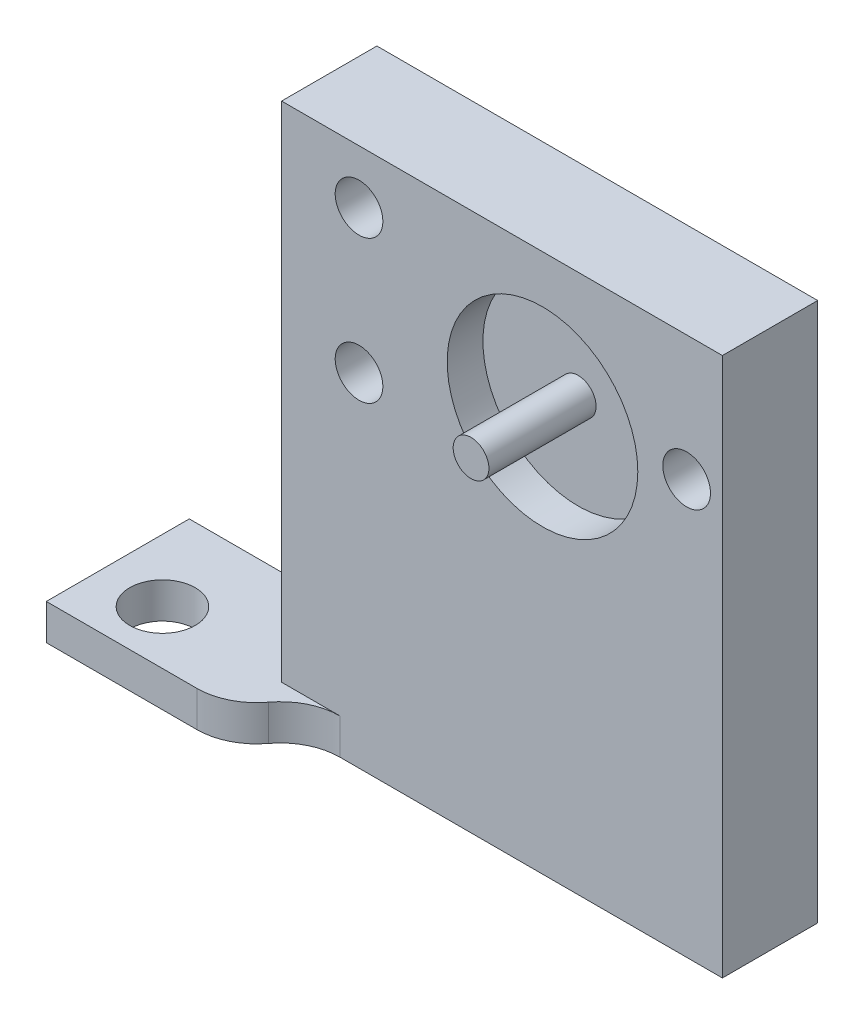
ISO-10303-21;
HEADER;
FILE_DESCRIPTION(('STEP AP214'),'2;1');
FILE_NAME('part.step','',(''),(''),'','','');
FILE_SCHEMA(('AUTOMOTIVE_DESIGN { 1 0 10303 214 1 1 1 1 }'));
ENDSEC;
DATA;
#1=APPLICATION_CONTEXT('core data for automotive mechanical design processes');
#2=APPLICATION_PROTOCOL_DEFINITION('international standard','automotive_design',2000,#1);
#3=PRODUCT_CONTEXT('',#1,'mechanical');
#4=PRODUCT('Part','Part','',(#3));
#5=PRODUCT_RELATED_PRODUCT_CATEGORY('part','',(#4));
#6=PRODUCT_DEFINITION_FORMATION('','',#4);
#7=PRODUCT_DEFINITION_CONTEXT('part definition',#1,'design');
#8=PRODUCT_DEFINITION('design','',#6,#7);
#9=PRODUCT_DEFINITION_SHAPE('','',#8);
#10=(LENGTH_UNIT() NAMED_UNIT(*) SI_UNIT(.MILLI.,.METRE.));
#11=(NAMED_UNIT(*) PLANE_ANGLE_UNIT() SI_UNIT($,.RADIAN.));
#12=(NAMED_UNIT(*) SI_UNIT($,.STERADIAN.) SOLID_ANGLE_UNIT());
#13=UNCERTAINTY_MEASURE_WITH_UNIT(LENGTH_MEASURE(1.E-05),#10,'distance_accuracy_value','');
#14=(GEOMETRIC_REPRESENTATION_CONTEXT(3) GLOBAL_UNCERTAINTY_ASSIGNED_CONTEXT((#13)) GLOBAL_UNIT_ASSIGNED_CONTEXT((#10,
#11,#12)) REPRESENTATION_CONTEXT('',''));
#15=CARTESIAN_POINT('',(0.,0.,0.));
#16=DIRECTION('',(0.,0.,1.));
#17=DIRECTION('',(1.,0.,0.));
#18=AXIS2_PLACEMENT_3D('',#15,#16,#17);
#19=CARTESIAN_POINT('',(0.,0.,8.));
#20=DIRECTION('',(0.,0.,1.));
#21=DIRECTION('',(1.,0.,0.));
#22=AXIS2_PLACEMENT_3D('',#19,#20,#21);
#23=PLANE('',#22);
#24=CARTESIAN_POINT('',(-12.,16.625,8.));
#25=DIRECTION('',(0.,0.,1.));
#26=DIRECTION('',(1.,0.,0.));
#27=AXIS2_PLACEMENT_3D('',#24,#25,#26);
#28=CIRCLE('',#27,2.);
#29=CARTESIAN_POINT('',(-10.,16.625,8.));
#30=VERTEX_POINT('',#29);
#31=EDGE_CURVE('E227',#30,#30,#28,.T.);
#32=ORIENTED_EDGE('',*,*,#31,.F.);
#33=EDGE_LOOP('',(#32));
#34=FACE_BOUND('',#33,.T.);
#35=CARTESIAN_POINT('',(-12.,4.625,8.));
#36=DIRECTION('',(0.,0.,1.));
#37=DIRECTION('',(1.,0.,0.));
#38=AXIS2_PLACEMENT_3D('',#35,#36,#37);
#39=CIRCLE('',#38,2.);
#40=CARTESIAN_POINT('',(-10.,4.625,8.));
#41=VERTEX_POINT('',#40);
#42=EDGE_CURVE('E221',#41,#41,#39,.T.);
#43=ORIENTED_EDGE('',*,*,#42,.F.);
#44=EDGE_LOOP('',(#43));
#45=FACE_BOUND('',#44,.T.);
#46=CARTESIAN_POINT('',(15.5,10.625,8.));
#47=DIRECTION('',(0.,0.,1.));
#48=DIRECTION('',(1.,0.,0.));
#49=AXIS2_PLACEMENT_3D('',#46,#47,#48);
#50=CIRCLE('',#49,2.);
#51=CARTESIAN_POINT('',(17.5,10.625,8.));
#52=VERTEX_POINT('',#51);
#53=EDGE_CURVE('E214',#52,#52,#50,.T.);
#54=ORIENTED_EDGE('',*,*,#53,.F.);
#55=EDGE_LOOP('',(#54));
#56=FACE_BOUND('',#55,.T.);
#57=CARTESIAN_POINT('',(3.4,9.125,8.));
#58=DIRECTION('',(0.,0.,1.));
#59=DIRECTION('',(1.,0.,0.));
#60=AXIS2_PLACEMENT_3D('',#57,#58,#59);
#61=CIRCLE('',#60,8.);
#62=CARTESIAN_POINT('',(11.4,9.125,8.));
#63=VERTEX_POINT('',#62);
#64=EDGE_CURVE('E204',#63,#63,#61,.T.);
#65=ORIENTED_EDGE('',*,*,#64,.F.);
#66=EDGE_LOOP('',(#65));
#67=FACE_BOUND('',#66,.T.);
#68=DIRECTION('',(1.,0.,0.));
#69=VECTOR('',#68,1.);
#70=CARTESIAN_POINT('',(0.,-21.125,8.));
#71=LINE('',#70,#69);
#72=CARTESIAN_POINT('',(-18.5,-21.125,8.));
#73=VERTEX_POINT('',#72);
#74=CARTESIAN_POINT('',(-13.6010205144336,-21.125,8.));
#75=VERTEX_POINT('',#74);
#76=EDGE_CURVE('E173',#73,#75,#71,.T.);
#77=ORIENTED_EDGE('',*,*,#76,.T.);
#78=DIRECTION('',(0.,-1.,0.));
#79=VECTOR('',#78,1.);
#80=CARTESIAN_POINT('',(-13.6010205144336,-24.125,8.));
#81=LINE('',#80,#79);
#82=CARTESIAN_POINT('',(-13.6010205144336,-24.125,8.));
#83=VERTEX_POINT('',#82);
#84=EDGE_CURVE('E117',#75,#83,#81,.T.);
#85=ORIENTED_EDGE('',*,*,#84,.T.);
#86=DIRECTION('',(1.,0.,0.));
#87=VECTOR('',#86,1.);
#88=CARTESIAN_POINT('',(0.,-24.125,8.));
#89=LINE('',#88,#87);
#90=CARTESIAN_POINT('',(18.5,-24.125,8.));
#91=VERTEX_POINT('',#90);
#92=EDGE_CURVE('E111',#83,#91,#89,.T.);
#93=ORIENTED_EDGE('',*,*,#92,.T.);
#94=DIRECTION('',(0.,1.,0.));
#95=VECTOR('',#94,1.);
#96=CARTESIAN_POINT('',(18.5,0.,8.));
#97=LINE('',#96,#95);
#98=CARTESIAN_POINT('',(18.5,21.125,8.));
#99=VERTEX_POINT('',#98);
#100=EDGE_CURVE('E114',#91,#99,#97,.T.);
#101=ORIENTED_EDGE('',*,*,#100,.T.);
#102=DIRECTION('',(-1.,0.,0.));
#103=VECTOR('',#102,1.);
#104=CARTESIAN_POINT('',(0.,21.125,8.));
#105=LINE('',#104,#103);
#106=CARTESIAN_POINT('',(-18.5,21.125,8.));
#107=VERTEX_POINT('',#106);
#108=EDGE_CURVE('E128',#99,#107,#105,.T.);
#109=ORIENTED_EDGE('',*,*,#108,.T.);
#110=DIRECTION('',(0.,-1.,0.));
#111=VECTOR('',#110,1.);
#112=CARTESIAN_POINT('',(-18.5,0.,8.));
#113=LINE('',#112,#111);
#114=EDGE_CURVE('E119',#107,#73,#113,.T.);
#115=ORIENTED_EDGE('',*,*,#114,.T.);
#116=EDGE_LOOP('',(#77,#85,#93,#101,#109,#115));
#117=FACE_BOUND('',#116,.T.);
#118=ADVANCED_FACE('F42',(#34,#45,#56,#67,#117),#23,.T.);
#119=CARTESIAN_POINT('',(-29.,-24.125,7.5));
#120=DIRECTION('',(0.,1.,0.));
#121=DIRECTION('',(-1.,0.,0.));
#122=AXIS2_PLACEMENT_3D('',#119,#120,#121);
#123=CYLINDRICAL_SURFACE('',#122,2.75);
#124=CARTESIAN_POINT('',(-29.,-24.125,7.5));
#125=DIRECTION('',(0.,-1.,0.));
#126=DIRECTION('',(1.,0.,0.));
#127=AXIS2_PLACEMENT_3D('',#124,#125,#126);
#128=CIRCLE('',#127,2.75);
#129=CARTESIAN_POINT('',(-26.25,-24.125,7.5));
#130=VERTEX_POINT('',#129);
#131=EDGE_CURVE('E135',#130,#130,#128,.T.);
#132=ORIENTED_EDGE('',*,*,#131,.T.);
#133=EDGE_LOOP('',(#132));
#134=FACE_BOUND('',#133,.T.);
#135=CARTESIAN_POINT('',(-29.,-21.125,7.5));
#136=DIRECTION('',(0.,-1.,0.));
#137=DIRECTION('',(1.,0.,0.));
#138=AXIS2_PLACEMENT_3D('',#135,#136,#137);
#139=CIRCLE('',#138,2.75);
#140=CARTESIAN_POINT('',(-26.25,-21.125,7.5));
#141=VERTEX_POINT('',#140);
#142=EDGE_CURVE('E151',#141,#141,#139,.T.);
#143=ORIENTED_EDGE('',*,*,#142,.F.);
#144=EDGE_LOOP('',(#143));
#145=FACE_BOUND('',#144,.T.);
#146=ADVANCED_FACE('F253',(#134,#145),#123,.F.);
#147=CARTESIAN_POINT('',(0.,0.,0.));
#148=DIRECTION('',(0.,0.,1.));
#149=DIRECTION('',(1.,0.,0.));
#150=AXIS2_PLACEMENT_3D('',#147,#148,#149);
#151=PLANE('',#150);
#152=CARTESIAN_POINT('',(-12.,16.625,0.));
#153=DIRECTION('',(0.,0.,1.));
#154=DIRECTION('',(1.,0.,0.));
#155=AXIS2_PLACEMENT_3D('',#152,#153,#154);
#156=CIRCLE('',#155,2.);
#157=CARTESIAN_POINT('',(-10.,16.625,0.));
#158=VERTEX_POINT('',#157);
#159=EDGE_CURVE('E213',#158,#158,#156,.T.);
#160=ORIENTED_EDGE('',*,*,#159,.T.);
#161=EDGE_LOOP('',(#160));
#162=FACE_BOUND('',#161,.T.);
#163=CARTESIAN_POINT('',(-12.,4.625,0.));
#164=DIRECTION('',(0.,0.,1.));
#165=DIRECTION('',(1.,0.,0.));
#166=AXIS2_PLACEMENT_3D('',#163,#164,#165);
#167=CIRCLE('',#166,2.);
#168=CARTESIAN_POINT('',(-10.,4.625,0.));
#169=VERTEX_POINT('',#168);
#170=EDGE_CURVE('E224',#169,#169,#167,.T.);
#171=ORIENTED_EDGE('',*,*,#170,.T.);
#172=EDGE_LOOP('',(#171));
#173=FACE_BOUND('',#172,.T.);
#174=CARTESIAN_POINT('',(15.5,10.625,0.));
#175=DIRECTION('',(0.,0.,1.));
#176=DIRECTION('',(1.,0.,0.));
#177=AXIS2_PLACEMENT_3D('',#174,#175,#176);
#178=CIRCLE('',#177,2.);
#179=CARTESIAN_POINT('',(17.5,10.625,0.));
#180=VERTEX_POINT('',#179);
#181=EDGE_CURVE('E217',#180,#180,#178,.T.);
#182=ORIENTED_EDGE('',*,*,#181,.T.);
#183=EDGE_LOOP('',(#182));
#184=FACE_BOUND('',#183,.T.);
#185=DIRECTION('',(0.,1.,0.));
#186=VECTOR('',#185,1.);
#187=CARTESIAN_POINT('',(-18.5,0.,0.));
#188=LINE('',#187,#186);
#189=CARTESIAN_POINT('',(-18.5,-21.125,0.));
#190=VERTEX_POINT('',#189);
#191=CARTESIAN_POINT('',(-18.5,21.125,0.));
#192=VERTEX_POINT('',#191);
#193=EDGE_CURVE('E160',#190,#192,#188,.T.);
#194=ORIENTED_EDGE('',*,*,#193,.T.);
#195=DIRECTION('',(-1.,0.,0.));
#196=VECTOR('',#195,1.);
#197=CARTESIAN_POINT('',(0.,21.125,0.));
#198=LINE('',#197,#196);
#199=CARTESIAN_POINT('',(18.5,21.125,0.));
#200=VERTEX_POINT('',#199);
#201=EDGE_CURVE('E165',#200,#192,#198,.T.);
#202=ORIENTED_EDGE('',*,*,#201,.F.);
#203=DIRECTION('',(0.,1.,0.));
#204=VECTOR('',#203,1.);
#205=CARTESIAN_POINT('',(18.5,0.,0.));
#206=LINE('',#205,#204);
#207=CARTESIAN_POINT('',(18.5,-24.125,0.));
#208=VERTEX_POINT('',#207);
#209=EDGE_CURVE('E163',#208,#200,#206,.T.);
#210=ORIENTED_EDGE('',*,*,#209,.F.);
#211=DIRECTION('',(1.,0.,0.));
#212=VECTOR('',#211,1.);
#213=CARTESIAN_POINT('',(0.,-24.125,0.));
#214=LINE('',#213,#212);
#215=CARTESIAN_POINT('',(-34.25,-24.125,0.));
#216=VERTEX_POINT('',#215);
#217=EDGE_CURVE('E134',#216,#208,#214,.T.);
#218=ORIENTED_EDGE('',*,*,#217,.F.);
#219=DIRECTION('',(0.,1.,0.));
#220=VECTOR('',#219,1.);
#221=CARTESIAN_POINT('',(-34.25,-24.125,0.));
#222=LINE('',#221,#220);
#223=CARTESIAN_POINT('',(-34.25,-21.125,0.));
#224=VERTEX_POINT('',#223);
#225=EDGE_CURVE('E138',#216,#224,#222,.T.);
#226=ORIENTED_EDGE('',*,*,#225,.T.);
#227=DIRECTION('',(1.,0.,0.));
#228=VECTOR('',#227,1.);
#229=CARTESIAN_POINT('',(0.,-21.125,0.));
#230=LINE('',#229,#228);
#231=EDGE_CURVE('E148',#224,#190,#230,.T.);
#232=ORIENTED_EDGE('',*,*,#231,.T.);
#233=EDGE_LOOP('',(#194,#202,#210,#218,#226,#232));
#234=FACE_BOUND('',#233,.T.);
#235=ADVANCED_FACE('F259',(#162,#173,#184,#234),#151,.F.);
#236=CARTESIAN_POINT('',(-34.25,-24.125,0.));
#237=DIRECTION('',(1.,0.,0.));
#238=DIRECTION('',(0.,1.,0.));
#239=AXIS2_PLACEMENT_3D('',#236,#237,#238);
#240=PLANE('',#239);
#241=DIRECTION('',(0.,0.,-1.));
#242=VECTOR('',#241,1.);
#243=CARTESIAN_POINT('',(-34.25,-21.125,0.));
#244=LINE('',#243,#242);
#245=CARTESIAN_POINT('',(-34.25,-21.125,12.));
#246=VERTEX_POINT('',#245);
#247=EDGE_CURVE('E146',#246,#224,#244,.T.);
#248=ORIENTED_EDGE('',*,*,#247,.T.);
#249=ORIENTED_EDGE('',*,*,#225,.F.);
#250=DIRECTION('',(0.,0.,-1.));
#251=VECTOR('',#250,1.);
#252=CARTESIAN_POINT('',(-34.25,-24.125,0.));
#253=LINE('',#252,#251);
#254=CARTESIAN_POINT('',(-34.25,-24.125,12.));
#255=VERTEX_POINT('',#254);
#256=EDGE_CURVE('E140',#255,#216,#253,.T.);
#257=ORIENTED_EDGE('',*,*,#256,.F.);
#258=DIRECTION('',(0.,1.,0.));
#259=VECTOR('',#258,1.);
#260=CARTESIAN_POINT('',(-34.25,-24.125,12.));
#261=LINE('',#260,#259);
#262=EDGE_CURVE('E157',#255,#246,#261,.T.);
#263=ORIENTED_EDGE('',*,*,#262,.T.);
#264=EDGE_LOOP('',(#248,#249,#257,#263));
#265=FACE_BOUND('',#264,.T.);
#266=ADVANCED_FACE('F197',(#265),#240,.F.);
#267=CARTESIAN_POINT('',(0.,21.125,12.));
#268=DIRECTION('',(0.,-1.,0.));
#269=DIRECTION('',(1.,0.,0.));
#270=AXIS2_PLACEMENT_3D('',#267,#268,#269);
#271=PLANE('',#270);
#272=ORIENTED_EDGE('',*,*,#108,.F.);
#273=DIRECTION('',(0.,0.,-1.));
#274=VECTOR('',#273,1.);
#275=CARTESIAN_POINT('',(18.5,21.125,12.));
#276=LINE('',#275,#274);
#277=EDGE_CURVE('E127',#99,#200,#276,.T.);
#278=ORIENTED_EDGE('',*,*,#277,.T.);
#279=ORIENTED_EDGE('',*,*,#201,.T.);
#280=DIRECTION('',(0.,0.,-1.));
#281=VECTOR('',#280,1.);
#282=CARTESIAN_POINT('',(-18.5,21.125,12.));
#283=LINE('',#282,#281);
#284=EDGE_CURVE('E168',#107,#192,#283,.T.);
#285=ORIENTED_EDGE('',*,*,#284,.F.);
#286=EDGE_LOOP('',(#272,#278,#279,#285));
#287=FACE_BOUND('',#286,.T.);
#288=ADVANCED_FACE('F268',(#287),#271,.F.);
#289=CARTESIAN_POINT('',(0.,-24.125,0.));
#290=DIRECTION('',(0.,-1.,0.));
#291=DIRECTION('',(1.,0.,0.));
#292=AXIS2_PLACEMENT_3D('',#289,#290,#291);
#293=PLANE('',#292);
#294=CARTESIAN_POINT('',(-13.6010205144336,-24.125,13.));
#295=DIRECTION('',(0.,-1.,0.));
#296=DIRECTION('',(1.,0.,0.));
#297=AXIS2_PLACEMENT_3D('',#294,#295,#296);
#298=CIRCLE('',#297,5.);
#299=CARTESIAN_POINT('',(-17.6010205144336,-24.125,10.));
#300=VERTEX_POINT('',#299);
#301=EDGE_CURVE('E176',#83,#300,#298,.F.);
#302=ORIENTED_EDGE('',*,*,#301,.T.);
#303=CARTESIAN_POINT('',(-21.6010205144336,-24.125,7.));
#304=DIRECTION('',(0.,-1.,0.));
#305=DIRECTION('',(1.,0.,0.));
#306=AXIS2_PLACEMENT_3D('',#303,#304,#305);
#307=CIRCLE('',#306,5.);
#308=CARTESIAN_POINT('',(-21.6010205144336,-24.125,12.));
#309=VERTEX_POINT('',#308);
#310=EDGE_CURVE('E64',#300,#309,#307,.T.);
#311=ORIENTED_EDGE('',*,*,#310,.T.);
#312=DIRECTION('',(-1.,0.,0.));
#313=VECTOR('',#312,1.);
#314=CARTESIAN_POINT('',(0.,-24.125,12.));
#315=LINE('',#314,#313);
#316=EDGE_CURVE('E154',#309,#255,#315,.T.);
#317=ORIENTED_EDGE('',*,*,#316,.T.);
#318=ORIENTED_EDGE('',*,*,#256,.T.);
#319=ORIENTED_EDGE('',*,*,#217,.T.);
#320=DIRECTION('',(0.,0.,1.));
#321=VECTOR('',#320,1.);
#322=CARTESIAN_POINT('',(18.5,-24.125,0.));
#323=LINE('',#322,#321);
#324=EDGE_CURVE('E126',#208,#91,#323,.T.);
#325=ORIENTED_EDGE('',*,*,#324,.T.);
#326=ORIENTED_EDGE('',*,*,#92,.F.);
#327=EDGE_LOOP('',(#302,#311,#317,#318,#319,#325,#326));
#328=FACE_BOUND('',#327,.T.);
#329=ORIENTED_EDGE('',*,*,#131,.F.);
#330=EDGE_LOOP('',(#329));
#331=FACE_BOUND('',#330,.T.);
#332=ADVANCED_FACE('F131',(#328,#331),#293,.T.);
#333=CARTESIAN_POINT('',(0.,-21.125,0.));
#334=DIRECTION('',(0.,-1.,0.));
#335=DIRECTION('',(1.,0.,0.));
#336=AXIS2_PLACEMENT_3D('',#333,#334,#335);
#337=PLANE('',#336);
#338=ORIENTED_EDGE('',*,*,#142,.T.);
#339=EDGE_LOOP('',(#338));
#340=FACE_BOUND('',#339,.T.);
#341=DIRECTION('',(-1.,0.,0.));
#342=VECTOR('',#341,1.);
#343=CARTESIAN_POINT('',(0.,-21.125,12.));
#344=LINE('',#343,#342);
#345=CARTESIAN_POINT('',(-21.6010205144336,-21.125,12.));
#346=VERTEX_POINT('',#345);
#347=EDGE_CURVE('E144',#346,#246,#344,.T.);
#348=ORIENTED_EDGE('',*,*,#347,.F.);
#349=CARTESIAN_POINT('',(-21.6010205144336,-21.125,7.));
#350=DIRECTION('',(0.,-1.,0.));
#351=DIRECTION('',(1.,0.,0.));
#352=AXIS2_PLACEMENT_3D('',#349,#350,#351);
#353=CIRCLE('',#352,5.);
#354=CARTESIAN_POINT('',(-17.6010205144336,-21.125,10.));
#355=VERTEX_POINT('',#354);
#356=EDGE_CURVE('E13',#346,#355,#353,.F.);
#357=ORIENTED_EDGE('',*,*,#356,.T.);
#358=CARTESIAN_POINT('',(-13.6010205144336,-21.125,13.));
#359=DIRECTION('',(0.,-1.,0.));
#360=DIRECTION('',(1.,0.,0.));
#361=AXIS2_PLACEMENT_3D('',#358,#359,#360);
#362=CIRCLE('',#361,5.);
#363=EDGE_CURVE('E178',#355,#75,#362,.T.);
#364=ORIENTED_EDGE('',*,*,#363,.T.);
#365=ORIENTED_EDGE('',*,*,#76,.F.);
#366=DIRECTION('',(0.,0.,-1.));
#367=VECTOR('',#366,1.);
#368=CARTESIAN_POINT('',(-18.5,-21.125,12.));
#369=LINE('',#368,#367);
#370=EDGE_CURVE('E171',#73,#190,#369,.T.);
#371=ORIENTED_EDGE('',*,*,#370,.T.);
#372=ORIENTED_EDGE('',*,*,#231,.F.);
#373=ORIENTED_EDGE('',*,*,#247,.F.);
#374=EDGE_LOOP('',(#348,#357,#364,#365,#371,#372,#373));
#375=FACE_BOUND('',#374,.T.);
#376=ADVANCED_FACE('F190',(#340,#375),#337,.F.);
#377=CARTESIAN_POINT('',(0.,0.,12.));
#378=DIRECTION('',(0.,0.,1.));
#379=DIRECTION('',(1.,0.,0.));
#380=AXIS2_PLACEMENT_3D('',#377,#378,#379);
#381=PLANE('',#380);
#382=ORIENTED_EDGE('',*,*,#316,.F.);
#383=DIRECTION('',(0.,-1.,0.));
#384=VECTOR('',#383,1.);
#385=CARTESIAN_POINT('',(-21.6010205144336,-21.125,12.));
#386=LINE('',#385,#384);
#387=EDGE_CURVE('E50',#309,#346,#386,.F.);
#388=ORIENTED_EDGE('',*,*,#387,.T.);
#389=ORIENTED_EDGE('',*,*,#347,.T.);
#390=ORIENTED_EDGE('',*,*,#262,.F.);
#391=EDGE_LOOP('',(#382,#388,#389,#390));
#392=FACE_BOUND('',#391,.T.);
#393=ADVANCED_FACE('F194',(#392),#381,.T.);
#394=CARTESIAN_POINT('',(18.5,0.,12.));
#395=DIRECTION('',(-1.,0.,0.));
#396=DIRECTION('',(0.,0.,1.));
#397=AXIS2_PLACEMENT_3D('',#394,#395,#396);
#398=PLANE('',#397);
#399=ORIENTED_EDGE('',*,*,#100,.F.);
#400=ORIENTED_EDGE('',*,*,#324,.F.);
#401=ORIENTED_EDGE('',*,*,#209,.T.);
#402=ORIENTED_EDGE('',*,*,#277,.F.);
#403=EDGE_LOOP('',(#399,#400,#401,#402));
#404=FACE_BOUND('',#403,.T.);
#405=ADVANCED_FACE('F124',(#404),#398,.F.);
#406=CARTESIAN_POINT('',(-18.5,0.,12.));
#407=DIRECTION('',(-1.,0.,0.));
#408=DIRECTION('',(0.,-1.,0.));
#409=AXIS2_PLACEMENT_3D('',#406,#407,#408);
#410=PLANE('',#409);
#411=ORIENTED_EDGE('',*,*,#370,.F.);
#412=ORIENTED_EDGE('',*,*,#114,.F.);
#413=ORIENTED_EDGE('',*,*,#284,.T.);
#414=ORIENTED_EDGE('',*,*,#193,.F.);
#415=EDGE_LOOP('',(#411,#412,#413,#414));
#416=FACE_BOUND('',#415,.T.);
#417=ADVANCED_FACE('F286',(#416),#410,.T.);
#418=CARTESIAN_POINT('',(3.4,9.125,-20.6274169979695));
#419=DIRECTION('',(0.,0.,1.));
#420=DIRECTION('',(1.,0.,0.));
#421=AXIS2_PLACEMENT_3D('',#418,#419,#420);
#422=CYLINDRICAL_SURFACE('',#421,8.);
#423=ORIENTED_EDGE('',*,*,#64,.T.);
#424=EDGE_LOOP('',(#423));
#425=FACE_BOUND('',#424,.T.);
#426=CARTESIAN_POINT('',(3.4,9.125,5.));
#427=DIRECTION('',(0.,0.,1.));
#428=DIRECTION('',(1.,0.,0.));
#429=AXIS2_PLACEMENT_3D('',#426,#427,#428);
#430=CIRCLE('',#429,8.);
#431=CARTESIAN_POINT('',(11.4,9.125,5.));
#432=VERTEX_POINT('',#431);
#433=EDGE_CURVE('E207',#432,#432,#430,.F.);
#434=ORIENTED_EDGE('',*,*,#433,.T.);
#435=EDGE_LOOP('',(#434));
#436=FACE_BOUND('',#435,.T.);
#437=ADVANCED_FACE('F246',(#425,#436),#422,.F.);
#438=CARTESIAN_POINT('',(0.,0.,5.));
#439=DIRECTION('',(0.,0.,1.));
#440=DIRECTION('',(1.,0.,0.));
#441=AXIS2_PLACEMENT_3D('',#438,#439,#440);
#442=PLANE('',#441);
#443=ORIENTED_EDGE('',*,*,#433,.F.);
#444=EDGE_LOOP('',(#443));
#445=FACE_BOUND('',#444,.T.);
#446=CARTESIAN_POINT('',(3.4,9.125,5.));
#447=DIRECTION('',(0.,0.,1.));
#448=DIRECTION('',(1.,0.,0.));
#449=AXIS2_PLACEMENT_3D('',#446,#447,#448);
#450=CIRCLE('',#449,1.50000000000001);
#451=CARTESIAN_POINT('',(4.90000000000001,9.125,5.));
#452=VERTEX_POINT('',#451);
#453=EDGE_CURVE('E210',#452,#452,#450,.F.);
#454=ORIENTED_EDGE('',*,*,#453,.T.);
#455=EDGE_LOOP('',(#454));
#456=FACE_BOUND('',#455,.T.);
#457=ADVANCED_FACE('F239',(#445,#456),#442,.T.);
#458=CARTESIAN_POINT('',(3.4,9.125,-10.9705627484772));
#459=DIRECTION('',(0.,0.,1.));
#460=DIRECTION('',(1.,0.,0.));
#461=AXIS2_PLACEMENT_3D('',#458,#459,#460);
#462=CYLINDRICAL_SURFACE('',#461,1.50000000000001);
#463=CARTESIAN_POINT('',(3.4,9.125,14.));
#464=DIRECTION('',(0.,0.,1.));
#465=DIRECTION('',(1.,0.,0.));
#466=AXIS2_PLACEMENT_3D('',#463,#464,#465);
#467=CIRCLE('',#466,1.50000000000001);
#468=CARTESIAN_POINT('',(4.90000000000001,9.125,14.));
#469=VERTEX_POINT('',#468);
#470=EDGE_CURVE('E218',#469,#469,#467,.T.);
#471=CARTESIAN_POINT('',(4.90000000000001,9.125,5.));
#472=CARTESIAN_POINT('',(4.90000000000001,9.125,5.09375));
#473=CARTESIAN_POINT('',(4.90000000000001,9.125,5.1875));
#474=CARTESIAN_POINT('',(4.90000000000001,9.125,5.375));
#475=CARTESIAN_POINT('',(4.90000000000001,9.125,5.46875));
#476=CARTESIAN_POINT('',(4.90000000000001,9.125,5.65625));
#477=CARTESIAN_POINT('',(4.90000000000001,9.125,5.75));
#478=CARTESIAN_POINT('',(4.90000000000001,9.125,5.9375));
#479=CARTESIAN_POINT('',(4.90000000000001,9.125,6.03125));
#480=CARTESIAN_POINT('',(4.90000000000001,9.125,6.21875));
#481=CARTESIAN_POINT('',(4.90000000000001,9.125,6.3125));
#482=CARTESIAN_POINT('',(4.90000000000001,9.125,6.5));
#483=CARTESIAN_POINT('',(4.90000000000001,9.125,6.59375));
#484=CARTESIAN_POINT('',(4.90000000000001,9.125,6.78125));
#485=CARTESIAN_POINT('',(4.90000000000001,9.125,6.875));
#486=CARTESIAN_POINT('',(4.90000000000001,9.125,7.0625));
#487=CARTESIAN_POINT('',(4.90000000000001,9.125,7.15625));
#488=CARTESIAN_POINT('',(4.90000000000001,9.125,7.34375));
#489=CARTESIAN_POINT('',(4.90000000000001,9.125,7.4375));
#490=CARTESIAN_POINT('',(4.90000000000001,9.125,7.625));
#491=CARTESIAN_POINT('',(4.90000000000001,9.125,7.71875));
#492=CARTESIAN_POINT('',(4.90000000000001,9.125,7.90625));
#493=CARTESIAN_POINT('',(4.90000000000001,9.125,8.));
#494=CARTESIAN_POINT('',(4.90000000000001,9.125,8.1875));
#495=CARTESIAN_POINT('',(4.90000000000001,9.125,8.28125));
#496=CARTESIAN_POINT('',(4.90000000000001,9.125,8.46875));
#497=CARTESIAN_POINT('',(4.90000000000001,9.125,8.5625));
#498=CARTESIAN_POINT('',(4.90000000000001,9.125,8.75));
#499=CARTESIAN_POINT('',(4.90000000000001,9.125,8.84375));
#500=CARTESIAN_POINT('',(4.90000000000001,9.125,9.03125));
#501=CARTESIAN_POINT('',(4.90000000000001,9.125,9.125));
#502=CARTESIAN_POINT('',(4.90000000000001,9.125,9.3125));
#503=CARTESIAN_POINT('',(4.90000000000001,9.125,9.40625));
#504=CARTESIAN_POINT('',(4.90000000000001,9.125,9.59375));
#505=CARTESIAN_POINT('',(4.90000000000001,9.125,9.6875));
#506=CARTESIAN_POINT('',(4.90000000000001,9.125,9.875));
#507=CARTESIAN_POINT('',(4.90000000000001,9.125,9.96875));
#508=CARTESIAN_POINT('',(4.90000000000001,9.125,10.15625));
#509=CARTESIAN_POINT('',(4.90000000000001,9.125,10.25));
#510=CARTESIAN_POINT('',(4.90000000000001,9.125,10.4375));
#511=CARTESIAN_POINT('',(4.90000000000001,9.125,10.53125));
#512=CARTESIAN_POINT('',(4.90000000000001,9.125,10.71875));
#513=CARTESIAN_POINT('',(4.90000000000001,9.125,10.8125));
#514=CARTESIAN_POINT('',(4.90000000000001,9.125,11.));
#515=CARTESIAN_POINT('',(4.90000000000001,9.125,11.09375));
#516=CARTESIAN_POINT('',(4.90000000000001,9.125,11.28125));
#517=CARTESIAN_POINT('',(4.90000000000001,9.125,11.375));
#518=CARTESIAN_POINT('',(4.90000000000001,9.125,11.5625));
#519=CARTESIAN_POINT('',(4.90000000000001,9.125,11.65625));
#520=CARTESIAN_POINT('',(4.90000000000001,9.125,11.84375));
#521=CARTESIAN_POINT('',(4.90000000000001,9.125,11.9375));
#522=CARTESIAN_POINT('',(4.90000000000001,9.125,12.125));
#523=CARTESIAN_POINT('',(4.90000000000001,9.125,12.21875));
#524=CARTESIAN_POINT('',(4.90000000000001,9.125,12.40625));
#525=CARTESIAN_POINT('',(4.90000000000001,9.125,12.5));
#526=CARTESIAN_POINT('',(4.90000000000001,9.125,12.6875));
#527=CARTESIAN_POINT('',(4.90000000000001,9.125,12.78125));
#528=CARTESIAN_POINT('',(4.90000000000001,9.125,12.96875));
#529=CARTESIAN_POINT('',(4.90000000000001,9.125,13.0625));
#530=CARTESIAN_POINT('',(4.90000000000001,9.125,13.25));
#531=CARTESIAN_POINT('',(4.90000000000001,9.125,13.34375));
#532=CARTESIAN_POINT('',(4.90000000000001,9.125,13.53125));
#533=CARTESIAN_POINT('',(4.90000000000001,9.125,13.625));
#534=CARTESIAN_POINT('',(4.90000000000001,9.125,13.8125));
#535=CARTESIAN_POINT('',(4.90000000000001,9.125,13.90625));
#536=CARTESIAN_POINT('',(4.90000000000001,9.125,14.));
#537=B_SPLINE_CURVE_WITH_KNOTS('',3,(#471,#472,#473,#474,#475,#476,#477,#478,#479,#480,#481,
#482,#483,#484,#485,#486,#487,#488,#489,#490,#491,#492,#493,#494,#495,#496,#497,#498,#499,#500,
#501,#502,#503,#504,#505,#506,#507,#508,#509,#510,#511,#512,#513,#514,#515,#516,#517,#518,#519,
#520,#521,#522,#523,#524,#525,#526,#527,#528,#529,#530,#531,#532,#533,#534,#535,#536),
.UNSPECIFIED.,.F.,.F.,(4,2,2,2,2,2,2,2,2,2,2,2,2,2,2,2,2,2,2,2,2,2,2,2,2,2,2,2,2,2,2,2,4),(0.,
0.28125,0.5625,0.843750000000001,1.125,1.40625,1.6875,1.96875,2.25,2.53125,2.8125,3.09375,3.375,
3.65625,3.9375,4.21875,4.5,4.78125,5.0625,5.34375,5.625,5.90625,6.1875,6.46875,6.75,7.03125,
7.3125,7.59375,7.875,8.15625,8.4375,8.71875,9.),.UNSPECIFIED.);
#538=EDGE_CURVE('BSEAM237',#452,#469,#537,.T.);
#539=ORIENTED_EDGE('',*,*,#453,.F.);
#540=ORIENTED_EDGE('',*,*,#470,.F.);
#541=ORIENTED_EDGE('',*,*,#538,.T.);
#542=ORIENTED_EDGE('',*,*,#538,.F.);
#543=EDGE_LOOP('',(#539,#541,#540,#542));
#544=FACE_BOUND('',#543,.T.);
#545=ADVANCED_FACE('F237',(#544),#462,.T.);
#546=CARTESIAN_POINT('',(-13.6010205144336,0.,13.));
#547=DIRECTION('',(0.,1.,0.));
#548=DIRECTION('',(-1.,0.,0.));
#549=AXIS2_PLACEMENT_3D('',#546,#547,#548);
#550=CYLINDRICAL_SURFACE('',#549,5.);
#551=ORIENTED_EDGE('',*,*,#363,.F.);
#552=DIRECTION('',(0.,1.,0.));
#553=VECTOR('',#552,1.);
#554=CARTESIAN_POINT('',(-17.6010205144336,0.,10.));
#555=LINE('',#554,#553);
#556=EDGE_CURVE('E180',#355,#300,#555,.F.);
#557=ORIENTED_EDGE('',*,*,#556,.T.);
#558=ORIENTED_EDGE('',*,*,#301,.F.);
#559=ORIENTED_EDGE('',*,*,#84,.F.);
#560=EDGE_LOOP('',(#551,#557,#558,#559));
#561=FACE_BOUND('',#560,.T.);
#562=ADVANCED_FACE('F186',(#561),#550,.F.);
#563=CARTESIAN_POINT('',(-21.6010205144336,0.,7.));
#564=DIRECTION('',(0.,1.,0.));
#565=DIRECTION('',(-1.,0.,0.));
#566=AXIS2_PLACEMENT_3D('',#563,#564,#565);
#567=CYLINDRICAL_SURFACE('',#566,5.);
#568=ORIENTED_EDGE('',*,*,#356,.F.);
#569=ORIENTED_EDGE('',*,*,#387,.F.);
#570=ORIENTED_EDGE('',*,*,#310,.F.);
#571=ORIENTED_EDGE('',*,*,#556,.F.);
#572=EDGE_LOOP('',(#568,#569,#570,#571));
#573=FACE_BOUND('',#572,.T.);
#574=ADVANCED_FACE('F44',(#573),#567,.T.);
#575=CARTESIAN_POINT('',(15.5,10.625,0.));
#576=DIRECTION('',(0.,0.,1.));
#577=DIRECTION('',(1.,0.,0.));
#578=AXIS2_PLACEMENT_3D('',#575,#576,#577);
#579=CYLINDRICAL_SURFACE('',#578,2.);
#580=ORIENTED_EDGE('',*,*,#181,.F.);
#581=EDGE_LOOP('',(#580));
#582=FACE_BOUND('',#581,.T.);
#583=ORIENTED_EDGE('',*,*,#53,.T.);
#584=EDGE_LOOP('',(#583));
#585=FACE_BOUND('',#584,.T.);
#586=ADVANCED_FACE('F303',(#582,#585),#579,.F.);
#587=CARTESIAN_POINT('',(-12.,4.625,0.));
#588=DIRECTION('',(0.,0.,1.));
#589=DIRECTION('',(1.,0.,0.));
#590=AXIS2_PLACEMENT_3D('',#587,#588,#589);
#591=CYLINDRICAL_SURFACE('',#590,2.);
#592=ORIENTED_EDGE('',*,*,#170,.F.);
#593=EDGE_LOOP('',(#592));
#594=FACE_BOUND('',#593,.T.);
#595=ORIENTED_EDGE('',*,*,#42,.T.);
#596=EDGE_LOOP('',(#595));
#597=FACE_BOUND('',#596,.T.);
#598=ADVANCED_FACE('F306',(#594,#597),#591,.F.);
#599=CARTESIAN_POINT('',(-12.,16.625,0.));
#600=DIRECTION('',(0.,0.,1.));
#601=DIRECTION('',(1.,0.,0.));
#602=AXIS2_PLACEMENT_3D('',#599,#600,#601);
#603=CYLINDRICAL_SURFACE('',#602,2.);
#604=ORIENTED_EDGE('',*,*,#159,.F.);
#605=EDGE_LOOP('',(#604));
#606=FACE_BOUND('',#605,.T.);
#607=ORIENTED_EDGE('',*,*,#31,.T.);
#608=EDGE_LOOP('',(#607));
#609=FACE_BOUND('',#608,.T.);
#610=ADVANCED_FACE('F310',(#606,#609),#603,.F.);
#611=CARTESIAN_POINT('',(0.,0.,14.));
#612=DIRECTION('',(0.,0.,1.));
#613=DIRECTION('',(1.,0.,0.));
#614=AXIS2_PLACEMENT_3D('',#611,#612,#613);
#615=PLANE('',#614);
#616=ORIENTED_EDGE('',*,*,#470,.T.);
#617=EDGE_LOOP('',(#616));
#618=FACE_BOUND('',#617,.T.);
#619=ADVANCED_FACE('F235',(#618),#615,.T.);
#620=CLOSED_SHELL('',(#118,#146,#235,#266,#288,#332,#376,#393,#405,#417,#437,#457,#545,#562,
#574,#586,#598,#610,#619));
#621=MANIFOLD_SOLID_BREP('B2',#620);
#622=ADVANCED_BREP_SHAPE_REPRESENTATION('',(#18,#621),#14);
#623=SHAPE_DEFINITION_REPRESENTATION(#9,#622);
ENDSEC;
END-ISO-10303-21;
